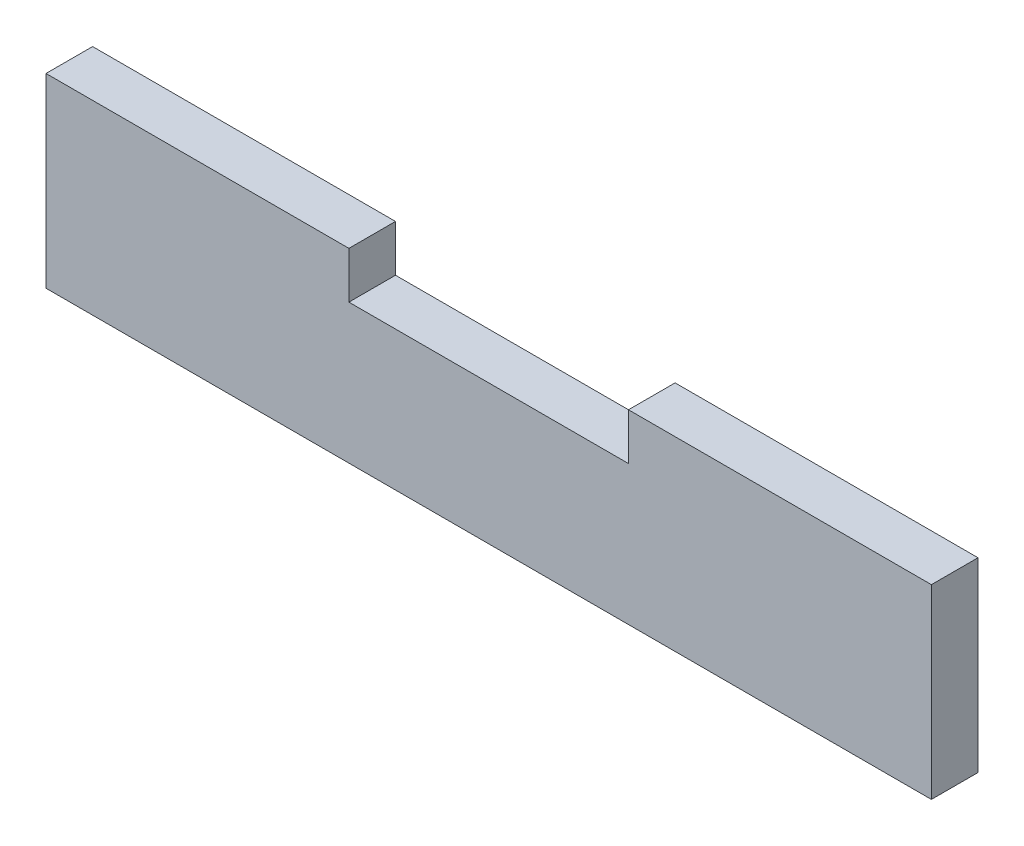
ISO-10303-21;
HEADER;
FILE_DESCRIPTION(('STEP AP214'),'2;1');
FILE_NAME('part.step','',(''),(''),'','','');
FILE_SCHEMA(('AUTOMOTIVE_DESIGN { 1 0 10303 214 1 1 1 1 }'));
ENDSEC;
DATA;
#1=APPLICATION_CONTEXT('core data for automotive mechanical design processes');
#2=APPLICATION_PROTOCOL_DEFINITION('international standard','automotive_design',2000,#1);
#3=PRODUCT_CONTEXT('',#1,'mechanical');
#4=PRODUCT('Part','Part','',(#3));
#5=PRODUCT_RELATED_PRODUCT_CATEGORY('part','',(#4));
#6=PRODUCT_DEFINITION_FORMATION('','',#4);
#7=PRODUCT_DEFINITION_CONTEXT('part definition',#1,'design');
#8=PRODUCT_DEFINITION('design','',#6,#7);
#9=PRODUCT_DEFINITION_SHAPE('','',#8);
#10=(LENGTH_UNIT() NAMED_UNIT(*) SI_UNIT(.MILLI.,.METRE.));
#11=(NAMED_UNIT(*) PLANE_ANGLE_UNIT() SI_UNIT($,.RADIAN.));
#12=(NAMED_UNIT(*) SI_UNIT($,.STERADIAN.) SOLID_ANGLE_UNIT());
#13=UNCERTAINTY_MEASURE_WITH_UNIT(LENGTH_MEASURE(1.E-05),#10,'distance_accuracy_value','');
#14=(GEOMETRIC_REPRESENTATION_CONTEXT(3) GLOBAL_UNCERTAINTY_ASSIGNED_CONTEXT((#13)) GLOBAL_UNIT_ASSIGNED_CONTEXT((#10,
#11,#12)) REPRESENTATION_CONTEXT('',''));
#15=CARTESIAN_POINT('',(0.,0.,0.));
#16=DIRECTION('',(0.,0.,1.));
#17=DIRECTION('',(1.,0.,0.));
#18=AXIS2_PLACEMENT_3D('',#15,#16,#17);
#19=CARTESIAN_POINT('',(-19.05,6.35,6.35));
#20=DIRECTION('',(-1.,0.,0.));
#21=DIRECTION('',(0.,0.,1.));
#22=AXIS2_PLACEMENT_3D('',#19,#20,#21);
#23=PLANE('',#22);
#24=DIRECTION('',(0.,1.,0.));
#25=VECTOR('',#24,1.);
#26=CARTESIAN_POINT('',(-19.05,6.35,0.));
#27=LINE('',#26,#25);
#28=CARTESIAN_POINT('',(-19.05,0.,0.));
#29=VERTEX_POINT('',#28);
#30=CARTESIAN_POINT('',(-19.05,6.35,0.));
#31=VERTEX_POINT('',#30);
#32=EDGE_CURVE('E140',#29,#31,#27,.T.);
#33=ORIENTED_EDGE('',*,*,#32,.T.);
#34=DIRECTION('',(0.,0.,-1.));
#35=VECTOR('',#34,1.);
#36=CARTESIAN_POINT('',(-19.05,6.35,6.35));
#37=LINE('',#36,#35);
#38=CARTESIAN_POINT('',(-19.05,6.35,6.35));
#39=VERTEX_POINT('',#38);
#40=EDGE_CURVE('E11',#39,#31,#37,.T.);
#41=ORIENTED_EDGE('',*,*,#40,.F.);
#42=DIRECTION('',(0.,1.,0.));
#43=VECTOR('',#42,1.);
#44=CARTESIAN_POINT('',(-19.05,6.35,6.35));
#45=LINE('',#44,#43);
#46=CARTESIAN_POINT('',(-19.05,0.,6.35));
#47=VERTEX_POINT('',#46);
#48=EDGE_CURVE('E162',#47,#39,#45,.T.);
#49=ORIENTED_EDGE('',*,*,#48,.F.);
#50=DIRECTION('',(0.,0.,-1.));
#51=VECTOR('',#50,1.);
#52=CARTESIAN_POINT('',(-19.05,0.,6.35));
#53=LINE('',#52,#51);
#54=EDGE_CURVE('E136',#47,#29,#53,.T.);
#55=ORIENTED_EDGE('',*,*,#54,.T.);
#56=EDGE_LOOP('',(#33,#41,#49,#55));
#57=FACE_BOUND('',#56,.T.);
#58=ADVANCED_FACE('F39',(#57),#23,.F.);
#59=CARTESIAN_POINT('',(-19.05,6.35,6.35));
#60=DIRECTION('',(0.,-1.,0.));
#61=DIRECTION('',(1.,0.,0.));
#62=AXIS2_PLACEMENT_3D('',#59,#60,#61);
#63=PLANE('',#62);
#64=DIRECTION('',(-1.,0.,0.));
#65=VECTOR('',#64,1.);
#66=CARTESIAN_POINT('',(-19.05,6.35,0.));
#67=LINE('',#66,#65);
#68=CARTESIAN_POINT('',(-60.325,6.34999999999999,0.));
#69=VERTEX_POINT('',#68);
#70=EDGE_CURVE('E144',#31,#69,#67,.T.);
#71=ORIENTED_EDGE('',*,*,#70,.T.);
#72=DIRECTION('',(0.,0.,-1.));
#73=VECTOR('',#72,1.);
#74=CARTESIAN_POINT('',(-60.325,6.34999999999999,6.35));
#75=LINE('',#74,#73);
#76=CARTESIAN_POINT('',(-60.325,6.34999999999999,6.35));
#77=VERTEX_POINT('',#76);
#78=EDGE_CURVE('E48',#77,#69,#75,.T.);
#79=ORIENTED_EDGE('',*,*,#78,.F.);
#80=DIRECTION('',(-1.,0.,0.));
#81=VECTOR('',#80,1.);
#82=CARTESIAN_POINT('',(-19.05,6.35,6.35));
#83=LINE('',#82,#81);
#84=EDGE_CURVE('E99',#39,#77,#83,.T.);
#85=ORIENTED_EDGE('',*,*,#84,.F.);
#86=ORIENTED_EDGE('',*,*,#40,.T.);
#87=EDGE_LOOP('',(#71,#79,#85,#86));
#88=FACE_BOUND('',#87,.T.);
#89=ADVANCED_FACE('F208',(#88),#63,.F.);
#90=CARTESIAN_POINT('',(-60.325,6.34999999999999,6.35));
#91=DIRECTION('',(1.,0.,0.));
#92=DIRECTION('',(0.,0.,-1.));
#93=AXIS2_PLACEMENT_3D('',#90,#91,#92);
#94=PLANE('',#93);
#95=DIRECTION('',(0.,-1.,0.));
#96=VECTOR('',#95,1.);
#97=CARTESIAN_POINT('',(-60.325,6.34999999999999,0.));
#98=LINE('',#97,#96);
#99=CARTESIAN_POINT('',(-60.325,-19.,0.));
#100=VERTEX_POINT('',#99);
#101=EDGE_CURVE('E147',#69,#100,#98,.T.);
#102=ORIENTED_EDGE('',*,*,#101,.T.);
#103=DIRECTION('',(0.,0.,-1.));
#104=VECTOR('',#103,1.);
#105=CARTESIAN_POINT('',(-60.325,-19.,6.35));
#106=LINE('',#105,#104);
#107=CARTESIAN_POINT('',(-60.325,-19.,6.35));
#108=VERTEX_POINT('',#107);
#109=EDGE_CURVE('E173',#108,#100,#106,.T.);
#110=ORIENTED_EDGE('',*,*,#109,.F.);
#111=DIRECTION('',(0.,-1.,0.));
#112=VECTOR('',#111,1.);
#113=CARTESIAN_POINT('',(-60.325,6.34999999999999,6.35));
#114=LINE('',#113,#112);
#115=EDGE_CURVE('E183',#77,#108,#114,.T.);
#116=ORIENTED_EDGE('',*,*,#115,.F.);
#117=ORIENTED_EDGE('',*,*,#78,.T.);
#118=EDGE_LOOP('',(#102,#110,#116,#117));
#119=FACE_BOUND('',#118,.T.);
#120=ADVANCED_FACE('F181',(#119),#94,.F.);
#121=CARTESIAN_POINT('',(-60.325,-19.,6.35));
#122=DIRECTION('',(0.,1.,0.));
#123=DIRECTION('',(0.,0.,1.));
#124=AXIS2_PLACEMENT_3D('',#121,#122,#123);
#125=PLANE('',#124);
#126=DIRECTION('',(1.,0.,0.));
#127=VECTOR('',#126,1.);
#128=CARTESIAN_POINT('',(-60.325,-19.,0.));
#129=LINE('',#128,#127);
#130=CARTESIAN_POINT('',(60.325,-19.,0.));
#131=VERTEX_POINT('',#130);
#132=EDGE_CURVE('E150',#100,#131,#129,.T.);
#133=ORIENTED_EDGE('',*,*,#132,.T.);
#134=DIRECTION('',(0.,0.,-1.));
#135=VECTOR('',#134,1.);
#136=CARTESIAN_POINT('',(60.325,-19.,6.35));
#137=LINE('',#136,#135);
#138=CARTESIAN_POINT('',(60.325,-19.,6.35));
#139=VERTEX_POINT('',#138);
#140=EDGE_CURVE('E169',#139,#131,#137,.T.);
#141=ORIENTED_EDGE('',*,*,#140,.F.);
#142=DIRECTION('',(1.,0.,0.));
#143=VECTOR('',#142,1.);
#144=CARTESIAN_POINT('',(-60.325,-19.,6.35));
#145=LINE('',#144,#143);
#146=EDGE_CURVE('E196',#108,#139,#145,.T.);
#147=ORIENTED_EDGE('',*,*,#146,.F.);
#148=ORIENTED_EDGE('',*,*,#109,.T.);
#149=EDGE_LOOP('',(#133,#141,#147,#148));
#150=FACE_BOUND('',#149,.T.);
#151=ADVANCED_FACE('F191',(#150),#125,.F.);
#152=CARTESIAN_POINT('',(60.325,-19.,6.35));
#153=DIRECTION('',(-1.,0.,0.));
#154=DIRECTION('',(0.,0.,1.));
#155=AXIS2_PLACEMENT_3D('',#152,#153,#154);
#156=PLANE('',#155);
#157=DIRECTION('',(0.,1.,0.));
#158=VECTOR('',#157,1.);
#159=CARTESIAN_POINT('',(60.325,-19.,0.));
#160=LINE('',#159,#158);
#161=CARTESIAN_POINT('',(60.325,6.34999999999999,0.));
#162=VERTEX_POINT('',#161);
#163=EDGE_CURVE('E153',#131,#162,#160,.T.);
#164=ORIENTED_EDGE('',*,*,#163,.T.);
#165=DIRECTION('',(0.,0.,-1.));
#166=VECTOR('',#165,1.);
#167=CARTESIAN_POINT('',(60.325,6.34999999999999,6.35));
#168=LINE('',#167,#166);
#169=CARTESIAN_POINT('',(60.325,6.34999999999999,6.35));
#170=VERTEX_POINT('',#169);
#171=EDGE_CURVE('E129',#170,#162,#168,.T.);
#172=ORIENTED_EDGE('',*,*,#171,.F.);
#173=DIRECTION('',(0.,1.,0.));
#174=VECTOR('',#173,1.);
#175=CARTESIAN_POINT('',(60.325,-19.,6.35));
#176=LINE('',#175,#174);
#177=EDGE_CURVE('E118',#139,#170,#176,.T.);
#178=ORIENTED_EDGE('',*,*,#177,.F.);
#179=ORIENTED_EDGE('',*,*,#140,.T.);
#180=EDGE_LOOP('',(#164,#172,#178,#179));
#181=FACE_BOUND('',#180,.T.);
#182=ADVANCED_FACE('F194',(#181),#156,.F.);
#183=CARTESIAN_POINT('',(60.325,6.34999999999999,6.35));
#184=DIRECTION('',(0.,-1.,0.));
#185=DIRECTION('',(1.,0.,0.));
#186=AXIS2_PLACEMENT_3D('',#183,#184,#185);
#187=PLANE('',#186);
#188=DIRECTION('',(-1.,0.,0.));
#189=VECTOR('',#188,1.);
#190=CARTESIAN_POINT('',(60.325,6.34999999999999,0.));
#191=LINE('',#190,#189);
#192=CARTESIAN_POINT('',(19.05,6.35,0.));
#193=VERTEX_POINT('',#192);
#194=EDGE_CURVE('E127',#162,#193,#191,.T.);
#195=ORIENTED_EDGE('',*,*,#194,.T.);
#196=DIRECTION('',(0.,0.,-1.));
#197=VECTOR('',#196,1.);
#198=CARTESIAN_POINT('',(19.05,6.35,6.35));
#199=LINE('',#198,#197);
#200=CARTESIAN_POINT('',(19.05,6.35,6.35));
#201=VERTEX_POINT('',#200);
#202=EDGE_CURVE('E124',#201,#193,#199,.T.);
#203=ORIENTED_EDGE('',*,*,#202,.F.);
#204=DIRECTION('',(-1.,0.,0.));
#205=VECTOR('',#204,1.);
#206=CARTESIAN_POINT('',(60.325,6.34999999999999,6.35));
#207=LINE('',#206,#205);
#208=EDGE_CURVE('E112',#170,#201,#207,.T.);
#209=ORIENTED_EDGE('',*,*,#208,.F.);
#210=ORIENTED_EDGE('',*,*,#171,.T.);
#211=EDGE_LOOP('',(#195,#203,#209,#210));
#212=FACE_BOUND('',#211,.T.);
#213=ADVANCED_FACE('F125',(#212),#187,.F.);
#214=CARTESIAN_POINT('',(19.05,0.,6.35));
#215=DIRECTION('',(1.,0.,0.));
#216=DIRECTION('',(0.,0.,-1.));
#217=AXIS2_PLACEMENT_3D('',#214,#215,#216);
#218=PLANE('',#217);
#219=DIRECTION('',(0.,-1.,0.));
#220=VECTOR('',#219,1.);
#221=CARTESIAN_POINT('',(19.05,0.,0.));
#222=LINE('',#221,#220);
#223=CARTESIAN_POINT('',(19.05,0.,0.));
#224=VERTEX_POINT('',#223);
#225=EDGE_CURVE('E85',#193,#224,#222,.T.);
#226=ORIENTED_EDGE('',*,*,#225,.T.);
#227=DIRECTION('',(0.,0.,-1.));
#228=VECTOR('',#227,1.);
#229=CARTESIAN_POINT('',(19.05,0.,6.35));
#230=LINE('',#229,#228);
#231=CARTESIAN_POINT('',(19.05,0.,6.35));
#232=VERTEX_POINT('',#231);
#233=EDGE_CURVE('E130',#232,#224,#230,.T.);
#234=ORIENTED_EDGE('',*,*,#233,.F.);
#235=DIRECTION('',(0.,-1.,0.));
#236=VECTOR('',#235,1.);
#237=CARTESIAN_POINT('',(19.05,0.,6.35));
#238=LINE('',#237,#236);
#239=EDGE_CURVE('E116',#201,#232,#238,.T.);
#240=ORIENTED_EDGE('',*,*,#239,.F.);
#241=ORIENTED_EDGE('',*,*,#202,.T.);
#242=EDGE_LOOP('',(#226,#234,#240,#241));
#243=FACE_BOUND('',#242,.T.);
#244=ADVANCED_FACE('F132',(#243),#218,.F.);
#245=CARTESIAN_POINT('',(-19.05,0.,6.35));
#246=DIRECTION('',(0.,-1.,0.));
#247=DIRECTION('',(1.,0.,0.));
#248=AXIS2_PLACEMENT_3D('',#245,#246,#247);
#249=PLANE('',#248);
#250=DIRECTION('',(-1.,0.,0.));
#251=VECTOR('',#250,1.);
#252=CARTESIAN_POINT('',(-19.05,0.,0.));
#253=LINE('',#252,#251);
#254=EDGE_CURVE('E91',#224,#29,#253,.T.);
#255=ORIENTED_EDGE('',*,*,#254,.T.);
#256=ORIENTED_EDGE('',*,*,#54,.F.);
#257=DIRECTION('',(-1.,0.,0.));
#258=VECTOR('',#257,1.);
#259=CARTESIAN_POINT('',(-19.05,0.,6.35));
#260=LINE('',#259,#258);
#261=EDGE_CURVE('E56',#232,#47,#260,.T.);
#262=ORIENTED_EDGE('',*,*,#261,.F.);
#263=ORIENTED_EDGE('',*,*,#233,.T.);
#264=EDGE_LOOP('',(#255,#256,#262,#263));
#265=FACE_BOUND('',#264,.T.);
#266=ADVANCED_FACE('F224',(#265),#249,.F.);
#267=CARTESIAN_POINT('',(0.,0.,6.35));
#268=DIRECTION('',(0.,0.,1.));
#269=DIRECTION('',(1.,0.,0.));
#270=AXIS2_PLACEMENT_3D('',#267,#268,#269);
#271=PLANE('',#270);
#272=ORIENTED_EDGE('',*,*,#48,.T.);
#273=ORIENTED_EDGE('',*,*,#84,.T.);
#274=ORIENTED_EDGE('',*,*,#115,.T.);
#275=ORIENTED_EDGE('',*,*,#146,.T.);
#276=ORIENTED_EDGE('',*,*,#177,.T.);
#277=ORIENTED_EDGE('',*,*,#208,.T.);
#278=ORIENTED_EDGE('',*,*,#239,.T.);
#279=ORIENTED_EDGE('',*,*,#261,.T.);
#280=EDGE_LOOP('',(#272,#273,#274,#275,#276,#277,#278,#279));
#281=FACE_BOUND('',#280,.T.);
#282=ADVANCED_FACE('F114',(#281),#271,.T.);
#283=CARTESIAN_POINT('',(0.,0.,0.));
#284=DIRECTION('',(0.,0.,1.));
#285=DIRECTION('',(1.,0.,0.));
#286=AXIS2_PLACEMENT_3D('',#283,#284,#285);
#287=PLANE('',#286);
#288=ORIENTED_EDGE('',*,*,#32,.F.);
#289=ORIENTED_EDGE('',*,*,#254,.F.);
#290=ORIENTED_EDGE('',*,*,#225,.F.);
#291=ORIENTED_EDGE('',*,*,#194,.F.);
#292=ORIENTED_EDGE('',*,*,#163,.F.);
#293=ORIENTED_EDGE('',*,*,#132,.F.);
#294=ORIENTED_EDGE('',*,*,#101,.F.);
#295=ORIENTED_EDGE('',*,*,#70,.F.);
#296=EDGE_LOOP('',(#288,#289,#290,#291,#292,#293,#294,#295));
#297=FACE_BOUND('',#296,.T.);
#298=ADVANCED_FACE('F187',(#297),#287,.F.);
#299=CLOSED_SHELL('',(#58,#89,#120,#151,#182,#213,#244,#266,#282,#298));
#300=MANIFOLD_SOLID_BREP('B2',#299);
#301=ADVANCED_BREP_SHAPE_REPRESENTATION('',(#18,#300),#14);
#302=SHAPE_DEFINITION_REPRESENTATION(#9,#301);
ENDSEC;
END-ISO-10303-21;
